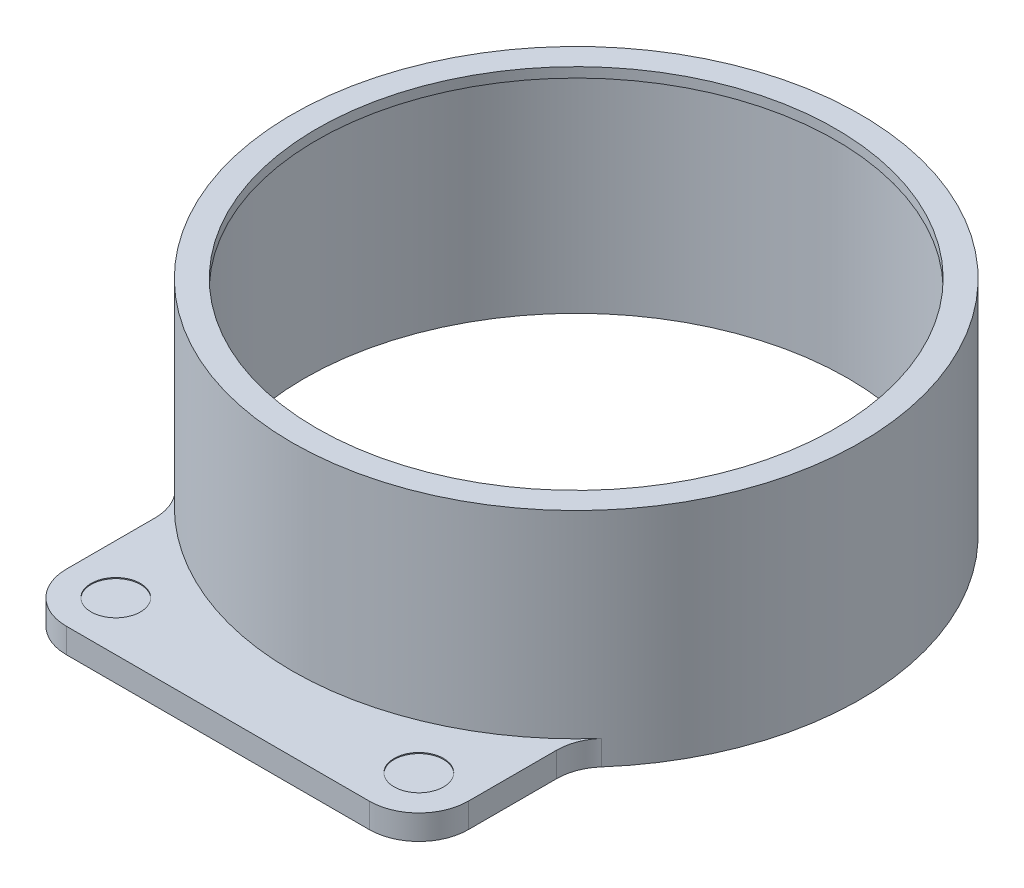
ISO-10303-21;
HEADER;
FILE_DESCRIPTION(('STEP AP214'),'2;1');
FILE_NAME('part.step','',(''),(''),'','','');
FILE_SCHEMA(('AUTOMOTIVE_DESIGN { 1 0 10303 214 1 1 1 1 }'));
ENDSEC;
DATA;
#1=APPLICATION_CONTEXT('core data for automotive mechanical design processes');
#2=APPLICATION_PROTOCOL_DEFINITION('international standard','automotive_design',2000,#1);
#3=PRODUCT_CONTEXT('',#1,'mechanical');
#4=PRODUCT('Part','Part','',(#3));
#5=PRODUCT_RELATED_PRODUCT_CATEGORY('part','',(#4));
#6=PRODUCT_DEFINITION_FORMATION('','',#4);
#7=PRODUCT_DEFINITION_CONTEXT('part definition',#1,'design');
#8=PRODUCT_DEFINITION('design','',#6,#7);
#9=PRODUCT_DEFINITION_SHAPE('','',#8);
#10=(LENGTH_UNIT() NAMED_UNIT(*) SI_UNIT(.MILLI.,.METRE.));
#11=(NAMED_UNIT(*) PLANE_ANGLE_UNIT() SI_UNIT($,.RADIAN.));
#12=(NAMED_UNIT(*) SI_UNIT($,.STERADIAN.) SOLID_ANGLE_UNIT());
#13=UNCERTAINTY_MEASURE_WITH_UNIT(LENGTH_MEASURE(1.E-05),#10,'distance_accuracy_value','');
#14=(GEOMETRIC_REPRESENTATION_CONTEXT(3) GLOBAL_UNCERTAINTY_ASSIGNED_CONTEXT((#13)) GLOBAL_UNIT_ASSIGNED_CONTEXT((#10,
#11,#12)) REPRESENTATION_CONTEXT('',''));
#15=CARTESIAN_POINT('',(0.,0.,0.));
#16=DIRECTION('',(0.,0.,1.));
#17=DIRECTION('',(1.,0.,0.));
#18=AXIS2_PLACEMENT_3D('',#15,#16,#17);
#19=CARTESIAN_POINT('',(0.,2.54,0.));
#20=DIRECTION('',(0.,1.,0.));
#21=DIRECTION('',(0.,0.,1.));
#22=AXIS2_PLACEMENT_3D('',#19,#20,#21);
#23=PLANE('',#22);
#24=CARTESIAN_POINT('',(0.,2.54,0.));
#25=DIRECTION('',(0.,1.,0.));
#26=DIRECTION('',(0.,0.,1.));
#27=AXIS2_PLACEMENT_3D('',#24,#25,#26);
#28=CIRCLE('',#27,66.675);
#29=CARTESIAN_POINT('',(0.,2.54,66.675));
#30=VERTEX_POINT('',#29);
#31=EDGE_CURVE('E127',#30,#30,#28,.T.);
#32=ORIENTED_EDGE('',*,*,#31,.F.);
#33=EDGE_LOOP('',(#32));
#34=FACE_BOUND('',#33,.T.);
#35=CARTESIAN_POINT('',(0.,2.54,0.));
#36=DIRECTION('',(0.,1.,0.));
#37=DIRECTION('',(0.,0.,1.));
#38=AXIS2_PLACEMENT_3D('',#35,#36,#37);
#39=CIRCLE('',#38,73.025);
#40=CARTESIAN_POINT('',(0.,2.54,73.025));
#41=VERTEX_POINT('',#40);
#42=EDGE_CURVE('E161',#41,#41,#39,.T.);
#43=ORIENTED_EDGE('',*,*,#42,.T.);
#44=EDGE_LOOP('',(#43));
#45=FACE_BOUND('',#44,.T.);
#46=ADVANCED_FACE('F35',(#34,#45),#23,.T.);
#47=CARTESIAN_POINT('',(0.,0.,0.));
#48=DIRECTION('',(0.,1.,0.));
#49=DIRECTION('',(0.,0.,1.));
#50=AXIS2_PLACEMENT_3D('',#47,#48,#49);
#51=PLANE('',#50);
#52=CARTESIAN_POINT('',(0.,0.,0.));
#53=DIRECTION('',(0.,1.,0.));
#54=DIRECTION('',(0.,0.,1.));
#55=AXIS2_PLACEMENT_3D('',#52,#53,#54);
#56=CIRCLE('',#55,69.865875);
#57=CARTESIAN_POINT('',(0.,0.,69.865875));
#58=VERTEX_POINT('',#57);
#59=EDGE_CURVE('E122',#58,#58,#56,.T.);
#60=ORIENTED_EDGE('',*,*,#59,.F.);
#61=EDGE_LOOP('',(#60));
#62=FACE_BOUND('',#61,.T.);
#63=CARTESIAN_POINT('',(0.,0.,0.));
#64=DIRECTION('',(0.,1.,0.));
#65=DIRECTION('',(0.,0.,1.));
#66=AXIS2_PLACEMENT_3D('',#63,#64,#65);
#67=CIRCLE('',#66,66.675);
#68=CARTESIAN_POINT('',(0.,0.,66.675));
#69=VERTEX_POINT('',#68);
#70=EDGE_CURVE('E160',#69,#69,#67,.T.);
#71=ORIENTED_EDGE('',*,*,#70,.T.);
#72=EDGE_LOOP('',(#71));
#73=FACE_BOUND('',#72,.T.);
#74=ADVANCED_FACE('F191',(#62,#73),#51,.F.);
#75=CARTESIAN_POINT('',(0.,2.54,0.));
#76=DIRECTION('',(0.,-1.,0.));
#77=DIRECTION('',(0.,0.,-1.));
#78=AXIS2_PLACEMENT_3D('',#75,#76,#77);
#79=CYLINDRICAL_SURFACE('',#78,66.675);
#80=ORIENTED_EDGE('',*,*,#31,.T.);
#81=EDGE_LOOP('',(#80));
#82=FACE_BOUND('',#81,.T.);
#83=ORIENTED_EDGE('',*,*,#70,.F.);
#84=EDGE_LOOP('',(#83));
#85=FACE_BOUND('',#84,.T.);
#86=ADVANCED_FACE('F193',(#82,#85),#79,.F.);
#87=CARTESIAN_POINT('',(0.,-54.61,0.));
#88=DIRECTION('',(0.,1.,0.));
#89=DIRECTION('',(0.,0.,1.));
#90=AXIS2_PLACEMENT_3D('',#87,#88,#89);
#91=CYLINDRICAL_SURFACE('',#90,69.865875);
#92=CARTESIAN_POINT('',(0.,-54.61,0.));
#93=DIRECTION('',(0.,1.,0.));
#94=DIRECTION('',(0.,0.,1.));
#95=AXIS2_PLACEMENT_3D('',#92,#93,#94);
#96=CIRCLE('',#95,69.865875);
#97=CARTESIAN_POINT('',(0.,-54.61,69.865875));
#98=VERTEX_POINT('',#97);
#99=EDGE_CURVE('E172',#98,#98,#96,.T.);
#100=ORIENTED_EDGE('',*,*,#99,.F.);
#101=EDGE_LOOP('',(#100));
#102=FACE_BOUND('',#101,.T.);
#103=ORIENTED_EDGE('',*,*,#59,.T.);
#104=EDGE_LOOP('',(#103));
#105=FACE_BOUND('',#104,.T.);
#106=ADVANCED_FACE('F195',(#102,#105),#91,.F.);
#107=CARTESIAN_POINT('',(0.,-54.61,0.));
#108=DIRECTION('',(0.,1.,0.));
#109=DIRECTION('',(0.,0.,1.));
#110=AXIS2_PLACEMENT_3D('',#107,#108,#109);
#111=CYLINDRICAL_SURFACE('',#110,73.025);
#112=CARTESIAN_POINT('',(0.,-48.26,0.));
#113=DIRECTION('',(0.,1.,0.));
#114=DIRECTION('',(0.,0.,-1.));
#115=AXIS2_PLACEMENT_3D('',#112,#113,#114);
#116=CIRCLE('',#115,73.025);
#117=CARTESIAN_POINT('',(-54.8051434078292,-48.26,48.2601997617838));
#118=VERTEX_POINT('',#117);
#119=CARTESIAN_POINT('',(54.8051434078292,-48.26,48.2601997617838));
#120=VERTEX_POINT('',#119);
#121=EDGE_CURVE('E50',#118,#120,#116,.T.);
#122=ORIENTED_EDGE('',*,*,#121,.T.);
#123=DIRECTION('',(0.,1.,0.));
#124=VECTOR('',#123,1.);
#125=CARTESIAN_POINT('',(54.8051434078292,-54.61,48.2601997617837));
#126=LINE('',#125,#124);
#127=CARTESIAN_POINT('',(54.8051434078292,-54.61,48.2601997617838));
#128=VERTEX_POINT('',#127);
#129=EDGE_CURVE('E145',#120,#128,#126,.F.);
#130=ORIENTED_EDGE('',*,*,#129,.T.);
#131=CARTESIAN_POINT('',(0.,-54.61,0.));
#132=DIRECTION('',(0.,1.,0.));
#133=DIRECTION('',(0.,0.,1.));
#134=AXIS2_PLACEMENT_3D('',#131,#132,#133);
#135=CIRCLE('',#134,73.025);
#136=CARTESIAN_POINT('',(-54.8051434078292,-54.61,48.2601997617838));
#137=VERTEX_POINT('',#136);
#138=EDGE_CURVE('E102',#128,#137,#135,.T.);
#139=ORIENTED_EDGE('',*,*,#138,.T.);
#140=DIRECTION('',(0.,1.,0.));
#141=VECTOR('',#140,1.);
#142=CARTESIAN_POINT('',(-54.8051434078292,-54.61,48.2601997617837));
#143=LINE('',#142,#141);
#144=EDGE_CURVE('E143',#137,#118,#143,.T.);
#145=ORIENTED_EDGE('',*,*,#144,.T.);
#146=EDGE_LOOP('',(#122,#130,#139,#145));
#147=FACE_BOUND('',#146,.T.);
#148=ORIENTED_EDGE('',*,*,#42,.F.);
#149=EDGE_LOOP('',(#148));
#150=FACE_BOUND('',#149,.T.);
#151=ADVANCED_FACE('F157',(#147,#150),#111,.T.);
#152=CARTESIAN_POINT('',(0.,-54.61,0.));
#153=DIRECTION('',(0.,1.,0.));
#154=DIRECTION('',(0.,0.,1.));
#155=AXIS2_PLACEMENT_3D('',#152,#153,#154);
#156=PLANE('',#155);
#157=ORIENTED_EDGE('',*,*,#99,.T.);
#158=EDGE_LOOP('',(#157));
#159=FACE_BOUND('',#158,.T.);
#160=DIRECTION('',(0.,0.,1.));
#161=VECTOR('',#160,1.);
#162=CARTESIAN_POINT('',(51.6364726961474,-54.61,51.6364726961479));
#163=LINE('',#162,#161);
#164=CARTESIAN_POINT('',(51.6364726961474,-54.61,56.6532779812244));
#165=VERTEX_POINT('',#164);
#166=CARTESIAN_POINT('',(51.6364726961474,-54.61,79.375));
#167=VERTEX_POINT('',#166);
#168=EDGE_CURVE('E100',#165,#167,#163,.T.);
#169=ORIENTED_EDGE('',*,*,#168,.T.);
#170=CARTESIAN_POINT('',(38.9364726961474,-54.61,79.375));
#171=DIRECTION('',(0.,1.,0.));
#172=DIRECTION('',(0.,0.,1.));
#173=AXIS2_PLACEMENT_3D('',#170,#171,#172);
#174=CIRCLE('',#173,12.7);
#175=CARTESIAN_POINT('',(38.9364726961474,-54.61,92.075));
#176=VERTEX_POINT('',#175);
#177=EDGE_CURVE('E132',#167,#176,#174,.F.);
#178=ORIENTED_EDGE('',*,*,#177,.T.);
#179=DIRECTION('',(-1.,0.,0.));
#180=VECTOR('',#179,1.);
#181=CARTESIAN_POINT('',(-51.6364726961474,-54.61,92.075));
#182=LINE('',#181,#180);
#183=CARTESIAN_POINT('',(-38.9364726961474,-54.61,92.075));
#184=VERTEX_POINT('',#183);
#185=EDGE_CURVE('E117',#176,#184,#182,.T.);
#186=ORIENTED_EDGE('',*,*,#185,.T.);
#187=CARTESIAN_POINT('',(-38.9364726961474,-54.61,79.375));
#188=DIRECTION('',(0.,1.,0.));
#189=DIRECTION('',(0.,0.,1.));
#190=AXIS2_PLACEMENT_3D('',#187,#188,#189);
#191=CIRCLE('',#190,12.7);
#192=CARTESIAN_POINT('',(-51.6364726961474,-54.61,79.375));
#193=VERTEX_POINT('',#192);
#194=EDGE_CURVE('E124',#184,#193,#191,.F.);
#195=ORIENTED_EDGE('',*,*,#194,.T.);
#196=DIRECTION('',(0.,0.,-1.));
#197=VECTOR('',#196,1.);
#198=CARTESIAN_POINT('',(-51.6364726961474,-54.61,51.6364726961479));
#199=LINE('',#198,#197);
#200=CARTESIAN_POINT('',(-51.6364726961474,-54.61,56.6532779812244));
#201=VERTEX_POINT('',#200);
#202=EDGE_CURVE('E153',#193,#201,#199,.T.);
#203=ORIENTED_EDGE('',*,*,#202,.T.);
#204=CARTESIAN_POINT('',(-64.3364726961474,-54.61,56.6532779812244));
#205=DIRECTION('',(0.,1.,0.));
#206=DIRECTION('',(0.,0.,1.));
#207=AXIS2_PLACEMENT_3D('',#204,#205,#206);
#208=CIRCLE('',#207,12.7);
#209=EDGE_CURVE('E43',#201,#137,#208,.T.);
#210=ORIENTED_EDGE('',*,*,#209,.T.);
#211=ORIENTED_EDGE('',*,*,#138,.F.);
#212=CARTESIAN_POINT('',(64.3364726961474,-54.61,56.6532779812244));
#213=DIRECTION('',(0.,1.,0.));
#214=DIRECTION('',(0.,0.,1.));
#215=AXIS2_PLACEMENT_3D('',#212,#213,#214);
#216=CIRCLE('',#215,12.7);
#217=EDGE_CURVE('E97',#128,#165,#216,.T.);
#218=ORIENTED_EDGE('',*,*,#217,.T.);
#219=EDGE_LOOP('',(#169,#178,#186,#195,#203,#210,#211,#218));
#220=FACE_BOUND('',#219,.T.);
#221=ADVANCED_FACE('F99',(#159,#220),#156,.F.);
#222=CARTESIAN_POINT('',(-51.6364726961474,-48.26,51.6364726961479));
#223=DIRECTION('',(-1.,0.,0.));
#224=DIRECTION('',(0.,0.,1.));
#225=AXIS2_PLACEMENT_3D('',#222,#223,#224);
#226=PLANE('',#225);
#227=ORIENTED_EDGE('',*,*,#202,.F.);
#228=DIRECTION('',(0.,-1.,0.));
#229=VECTOR('',#228,1.);
#230=CARTESIAN_POINT('',(-51.6364726961474,-48.26,79.375));
#231=LINE('',#230,#229);
#232=CARTESIAN_POINT('',(-51.6364726961474,-48.26,79.375));
#233=VERTEX_POINT('',#232);
#234=EDGE_CURVE('E107',#193,#233,#231,.F.);
#235=ORIENTED_EDGE('',*,*,#234,.T.);
#236=DIRECTION('',(0.,0.,-1.));
#237=VECTOR('',#236,1.);
#238=CARTESIAN_POINT('',(-51.6364726961474,-48.26,51.6364726961479));
#239=LINE('',#238,#237);
#240=CARTESIAN_POINT('',(-51.6364726961474,-48.26,56.6532779812244));
#241=VERTEX_POINT('',#240);
#242=EDGE_CURVE('E167',#233,#241,#239,.T.);
#243=ORIENTED_EDGE('',*,*,#242,.T.);
#244=DIRECTION('',(0.,-1.,0.));
#245=VECTOR('',#244,1.);
#246=CARTESIAN_POINT('',(-51.6364726961474,-54.61,56.6532779812244));
#247=LINE('',#246,#245);
#248=EDGE_CURVE('E147',#241,#201,#247,.T.);
#249=ORIENTED_EDGE('',*,*,#248,.T.);
#250=EDGE_LOOP('',(#227,#235,#243,#249));
#251=FACE_BOUND('',#250,.T.);
#252=ADVANCED_FACE('F170',(#251),#226,.T.);
#253=CARTESIAN_POINT('',(-51.6364726961474,-48.26,92.075));
#254=DIRECTION('',(0.,0.,1.));
#255=DIRECTION('',(1.,0.,0.));
#256=AXIS2_PLACEMENT_3D('',#253,#254,#255);
#257=PLANE('',#256);
#258=ORIENTED_EDGE('',*,*,#185,.F.);
#259=DIRECTION('',(0.,-1.,0.));
#260=VECTOR('',#259,1.);
#261=CARTESIAN_POINT('',(38.9364726961474,-48.26,92.075));
#262=LINE('',#261,#260);
#263=CARTESIAN_POINT('',(38.9364726961474,-48.26,92.075));
#264=VERTEX_POINT('',#263);
#265=EDGE_CURVE('E137',#176,#264,#262,.F.);
#266=ORIENTED_EDGE('',*,*,#265,.T.);
#267=DIRECTION('',(-1.,0.,0.));
#268=VECTOR('',#267,1.);
#269=CARTESIAN_POINT('',(-51.6364726961474,-48.26,92.075));
#270=LINE('',#269,#268);
#271=CARTESIAN_POINT('',(-38.9364726961474,-48.26,92.075));
#272=VERTEX_POINT('',#271);
#273=EDGE_CURVE('E173',#264,#272,#270,.T.);
#274=ORIENTED_EDGE('',*,*,#273,.T.);
#275=DIRECTION('',(0.,-1.,0.));
#276=VECTOR('',#275,1.);
#277=CARTESIAN_POINT('',(-38.9364726961474,-48.26,92.075));
#278=LINE('',#277,#276);
#279=EDGE_CURVE('E134',#272,#184,#278,.T.);
#280=ORIENTED_EDGE('',*,*,#279,.T.);
#281=EDGE_LOOP('',(#258,#266,#274,#280));
#282=FACE_BOUND('',#281,.T.);
#283=ADVANCED_FACE('F231',(#282),#257,.T.);
#284=CARTESIAN_POINT('',(51.6364726961474,-48.26,51.6364726961479));
#285=DIRECTION('',(1.,0.,0.));
#286=DIRECTION('',(0.,0.,-1.));
#287=AXIS2_PLACEMENT_3D('',#284,#285,#286);
#288=PLANE('',#287);
#289=DIRECTION('',(0.,0.,1.));
#290=VECTOR('',#289,1.);
#291=CARTESIAN_POINT('',(51.6364726961474,-48.26,51.6364726961479));
#292=LINE('',#291,#290);
#293=CARTESIAN_POINT('',(51.6364726961474,-48.26,56.6532779812244));
#294=VERTEX_POINT('',#293);
#295=CARTESIAN_POINT('',(51.6364726961474,-48.26,79.375));
#296=VERTEX_POINT('',#295);
#297=EDGE_CURVE('E178',#294,#296,#292,.T.);
#298=ORIENTED_EDGE('',*,*,#297,.T.);
#299=DIRECTION('',(0.,-1.,0.));
#300=VECTOR('',#299,1.);
#301=CARTESIAN_POINT('',(51.6364726961474,-48.26,79.375));
#302=LINE('',#301,#300);
#303=EDGE_CURVE('E116',#296,#167,#302,.T.);
#304=ORIENTED_EDGE('',*,*,#303,.T.);
#305=ORIENTED_EDGE('',*,*,#168,.F.);
#306=DIRECTION('',(0.,-1.,0.));
#307=VECTOR('',#306,1.);
#308=CARTESIAN_POINT('',(51.6364726961474,-48.26,56.6532779812244));
#309=LINE('',#308,#307);
#310=EDGE_CURVE('E113',#165,#294,#309,.F.);
#311=ORIENTED_EDGE('',*,*,#310,.T.);
#312=EDGE_LOOP('',(#298,#304,#305,#311));
#313=FACE_BOUND('',#312,.T.);
#314=ADVANCED_FACE('F112',(#313),#288,.T.);
#315=CARTESIAN_POINT('',(0.,-48.26,0.));
#316=DIRECTION('',(0.,-1.,0.));
#317=DIRECTION('',(0.,0.,-1.));
#318=AXIS2_PLACEMENT_3D('',#315,#316,#317);
#319=PLANE('',#318);
#320=CARTESIAN_POINT('',(-38.9364726961474,-48.26,79.375));
#321=DIRECTION('',(0.,1.,0.));
#322=DIRECTION('',(0.,0.,1.));
#323=AXIS2_PLACEMENT_3D('',#320,#321,#322);
#324=CIRCLE('',#323,6.35);
#325=CARTESIAN_POINT('',(-38.9364726961474,-48.26,85.725));
#326=VERTEX_POINT('',#325);
#327=EDGE_CURVE('E241',#326,#326,#324,.T.);
#328=ORIENTED_EDGE('',*,*,#327,.F.);
#329=EDGE_LOOP('',(#328));
#330=FACE_BOUND('',#329,.T.);
#331=CARTESIAN_POINT('',(38.9364726961474,-48.26,79.375));
#332=DIRECTION('',(0.,1.,0.));
#333=DIRECTION('',(0.,0.,1.));
#334=AXIS2_PLACEMENT_3D('',#331,#332,#333);
#335=CIRCLE('',#334,6.35);
#336=CARTESIAN_POINT('',(38.9364726961474,-48.26,85.725));
#337=VERTEX_POINT('',#336);
#338=EDGE_CURVE('E235',#337,#337,#335,.T.);
#339=ORIENTED_EDGE('',*,*,#338,.F.);
#340=EDGE_LOOP('',(#339));
#341=FACE_BOUND('',#340,.T.);
#342=ORIENTED_EDGE('',*,*,#273,.F.);
#343=CARTESIAN_POINT('',(38.9364726961474,-48.26,79.375));
#344=DIRECTION('',(0.,-1.,0.));
#345=DIRECTION('',(0.,0.,-1.));
#346=AXIS2_PLACEMENT_3D('',#343,#344,#345);
#347=CIRCLE('',#346,12.7);
#348=EDGE_CURVE('E141',#264,#296,#347,.F.);
#349=ORIENTED_EDGE('',*,*,#348,.T.);
#350=ORIENTED_EDGE('',*,*,#297,.F.);
#351=CARTESIAN_POINT('',(64.3364726961474,-48.26,56.6532779812244));
#352=DIRECTION('',(0.,-1.,0.));
#353=DIRECTION('',(0.,0.,-1.));
#354=AXIS2_PLACEMENT_3D('',#351,#352,#353);
#355=CIRCLE('',#354,12.7);
#356=EDGE_CURVE('E106',#294,#120,#355,.T.);
#357=ORIENTED_EDGE('',*,*,#356,.T.);
#358=ORIENTED_EDGE('',*,*,#121,.F.);
#359=CARTESIAN_POINT('',(-64.3364726961474,-48.26,56.6532779812244));
#360=DIRECTION('',(0.,-1.,0.));
#361=DIRECTION('',(0.,0.,-1.));
#362=AXIS2_PLACEMENT_3D('',#359,#360,#361);
#363=CIRCLE('',#362,12.7);
#364=EDGE_CURVE('E11',#118,#241,#363,.T.);
#365=ORIENTED_EDGE('',*,*,#364,.T.);
#366=ORIENTED_EDGE('',*,*,#242,.F.);
#367=CARTESIAN_POINT('',(-38.9364726961474,-48.26,79.375));
#368=DIRECTION('',(0.,-1.,0.));
#369=DIRECTION('',(0.,0.,-1.));
#370=AXIS2_PLACEMENT_3D('',#367,#368,#369);
#371=CIRCLE('',#370,12.7);
#372=EDGE_CURVE('E139',#233,#272,#371,.F.);
#373=ORIENTED_EDGE('',*,*,#372,.T.);
#374=EDGE_LOOP('',(#342,#349,#350,#357,#358,#365,#366,#373));
#375=FACE_BOUND('',#374,.T.);
#376=ADVANCED_FACE('F166',(#330,#341,#375),#319,.F.);
#377=CARTESIAN_POINT('',(38.9364726961474,-48.26,79.375));
#378=DIRECTION('',(0.,-1.,0.));
#379=DIRECTION('',(0.,0.,-1.));
#380=AXIS2_PLACEMENT_3D('',#377,#378,#379);
#381=CYLINDRICAL_SURFACE('',#380,12.7);
#382=ORIENTED_EDGE('',*,*,#348,.F.);
#383=ORIENTED_EDGE('',*,*,#265,.F.);
#384=ORIENTED_EDGE('',*,*,#177,.F.);
#385=ORIENTED_EDGE('',*,*,#303,.F.);
#386=EDGE_LOOP('',(#382,#383,#384,#385));
#387=FACE_BOUND('',#386,.T.);
#388=ADVANCED_FACE('F215',(#387),#381,.T.);
#389=CARTESIAN_POINT('',(64.3364726961474,-54.61,56.6532779812244));
#390=DIRECTION('',(0.,1.,0.));
#391=DIRECTION('',(0.,0.,1.));
#392=AXIS2_PLACEMENT_3D('',#389,#390,#391);
#393=CYLINDRICAL_SURFACE('',#392,12.7);
#394=ORIENTED_EDGE('',*,*,#356,.F.);
#395=ORIENTED_EDGE('',*,*,#310,.F.);
#396=ORIENTED_EDGE('',*,*,#217,.F.);
#397=ORIENTED_EDGE('',*,*,#129,.F.);
#398=EDGE_LOOP('',(#394,#395,#396,#397));
#399=FACE_BOUND('',#398,.T.);
#400=ADVANCED_FACE('F121',(#399),#393,.F.);
#401=CARTESIAN_POINT('',(-38.9364726961474,-48.26,79.375));
#402=DIRECTION('',(0.,-1.,0.));
#403=DIRECTION('',(0.,0.,-1.));
#404=AXIS2_PLACEMENT_3D('',#401,#402,#403);
#405=CYLINDRICAL_SURFACE('',#404,12.7);
#406=ORIENTED_EDGE('',*,*,#372,.F.);
#407=ORIENTED_EDGE('',*,*,#234,.F.);
#408=ORIENTED_EDGE('',*,*,#194,.F.);
#409=ORIENTED_EDGE('',*,*,#279,.F.);
#410=EDGE_LOOP('',(#406,#407,#408,#409));
#411=FACE_BOUND('',#410,.T.);
#412=ADVANCED_FACE('F220',(#411),#405,.T.);
#413=CARTESIAN_POINT('',(-64.3364726961474,-54.61,56.6532779812244));
#414=DIRECTION('',(0.,1.,0.));
#415=DIRECTION('',(0.,0.,1.));
#416=AXIS2_PLACEMENT_3D('',#413,#414,#415);
#417=CYLINDRICAL_SURFACE('',#416,12.7);
#418=ORIENTED_EDGE('',*,*,#364,.F.);
#419=ORIENTED_EDGE('',*,*,#144,.F.);
#420=ORIENTED_EDGE('',*,*,#209,.F.);
#421=ORIENTED_EDGE('',*,*,#248,.F.);
#422=EDGE_LOOP('',(#418,#419,#420,#421));
#423=FACE_BOUND('',#422,.T.);
#424=ADVANCED_FACE('F37',(#423),#417,.F.);
#425=CARTESIAN_POINT('',(38.9364726961474,-48.514,79.375));
#426=DIRECTION('',(0.,1.,0.));
#427=DIRECTION('',(0.,0.,1.));
#428=AXIS2_PLACEMENT_3D('',#425,#426,#427);
#429=CYLINDRICAL_SURFACE('',#428,6.35);
#430=CARTESIAN_POINT('',(38.9364726961474,-48.514,79.375));
#431=DIRECTION('',(0.,1.,0.));
#432=DIRECTION('',(0.,0.,1.));
#433=AXIS2_PLACEMENT_3D('',#430,#431,#432);
#434=CIRCLE('',#433,6.35);
#435=CARTESIAN_POINT('',(38.9364726961474,-48.514,85.725));
#436=VERTEX_POINT('',#435);
#437=EDGE_CURVE('E238',#436,#436,#434,.T.);
#438=ORIENTED_EDGE('',*,*,#437,.F.);
#439=EDGE_LOOP('',(#438));
#440=FACE_BOUND('',#439,.T.);
#441=ORIENTED_EDGE('',*,*,#338,.T.);
#442=EDGE_LOOP('',(#441));
#443=FACE_BOUND('',#442,.T.);
#444=ADVANCED_FACE('F226',(#440,#443),#429,.F.);
#445=CARTESIAN_POINT('',(38.9364726961474,-48.514,79.375));
#446=DIRECTION('',(0.,1.,0.));
#447=DIRECTION('',(0.,0.,1.));
#448=AXIS2_PLACEMENT_3D('',#445,#446,#447);
#449=PLANE('',#448);
#450=ORIENTED_EDGE('',*,*,#437,.T.);
#451=EDGE_LOOP('',(#450));
#452=FACE_BOUND('',#451,.T.);
#453=ADVANCED_FACE('F252',(#452),#449,.T.);
#454=CARTESIAN_POINT('',(-38.9364726961474,-48.514,79.375));
#455=DIRECTION('',(0.,1.,0.));
#456=DIRECTION('',(0.,0.,1.));
#457=AXIS2_PLACEMENT_3D('',#454,#455,#456);
#458=CYLINDRICAL_SURFACE('',#457,6.35);
#459=CARTESIAN_POINT('',(-38.9364726961474,-48.514,79.375));
#460=DIRECTION('',(0.,1.,0.));
#461=DIRECTION('',(0.,0.,1.));
#462=AXIS2_PLACEMENT_3D('',#459,#460,#461);
#463=CIRCLE('',#462,6.35);
#464=CARTESIAN_POINT('',(-38.9364726961474,-48.514,85.725));
#465=VERTEX_POINT('',#464);
#466=EDGE_CURVE('E118',#465,#465,#463,.T.);
#467=ORIENTED_EDGE('',*,*,#466,.F.);
#468=EDGE_LOOP('',(#467));
#469=FACE_BOUND('',#468,.T.);
#470=ORIENTED_EDGE('',*,*,#327,.T.);
#471=EDGE_LOOP('',(#470));
#472=FACE_BOUND('',#471,.T.);
#473=ADVANCED_FACE('F249',(#469,#472),#458,.F.);
#474=CARTESIAN_POINT('',(-38.9364726961474,-48.514,79.375));
#475=DIRECTION('',(0.,1.,0.));
#476=DIRECTION('',(0.,0.,1.));
#477=AXIS2_PLACEMENT_3D('',#474,#475,#476);
#478=PLANE('',#477);
#479=ORIENTED_EDGE('',*,*,#466,.T.);
#480=EDGE_LOOP('',(#479));
#481=FACE_BOUND('',#480,.T.);
#482=ADVANCED_FACE('F247',(#481),#478,.T.);
#483=CLOSED_SHELL('',(#46,#74,#86,#106,#151,#221,#252,#283,#314,#376,#388,#400,#412,#424,#444,
#453,#473,#482));
#484=MANIFOLD_SOLID_BREP('B2',#483);
#485=ADVANCED_BREP_SHAPE_REPRESENTATION('',(#18,#484),#14);
#486=SHAPE_DEFINITION_REPRESENTATION(#9,#485);
ENDSEC;
END-ISO-10303-21;
